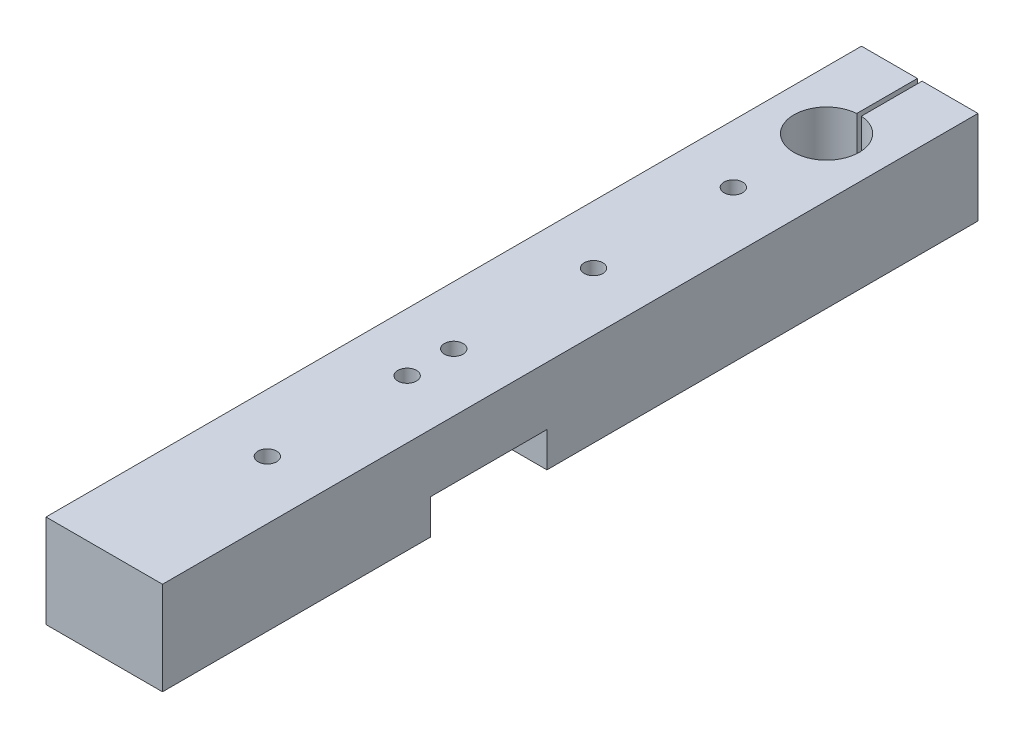
ISO-10303-21;
HEADER;
FILE_DESCRIPTION(('STEP AP214'),'2;1');
FILE_NAME('part.step','',(''),(''),'','','');
FILE_SCHEMA(('AUTOMOTIVE_DESIGN { 1 0 10303 214 1 1 1 1 }'));
ENDSEC;
DATA;
#1=APPLICATION_CONTEXT('core data for automotive mechanical design processes');
#2=APPLICATION_PROTOCOL_DEFINITION('international standard','automotive_design',2000,#1);
#3=PRODUCT_CONTEXT('',#1,'mechanical');
#4=PRODUCT('Part','Part','',(#3));
#5=PRODUCT_RELATED_PRODUCT_CATEGORY('part','',(#4));
#6=PRODUCT_DEFINITION_FORMATION('','',#4);
#7=PRODUCT_DEFINITION_CONTEXT('part definition',#1,'design');
#8=PRODUCT_DEFINITION('design','',#6,#7);
#9=PRODUCT_DEFINITION_SHAPE('','',#8);
#10=(LENGTH_UNIT() NAMED_UNIT(*) SI_UNIT(.MILLI.,.METRE.));
#11=(NAMED_UNIT(*) PLANE_ANGLE_UNIT() SI_UNIT($,.RADIAN.));
#12=(NAMED_UNIT(*) SI_UNIT($,.STERADIAN.) SOLID_ANGLE_UNIT());
#13=UNCERTAINTY_MEASURE_WITH_UNIT(LENGTH_MEASURE(1.E-05),#10,'distance_accuracy_value','');
#14=(GEOMETRIC_REPRESENTATION_CONTEXT(3) GLOBAL_UNCERTAINTY_ASSIGNED_CONTEXT((#13)) GLOBAL_UNIT_ASSIGNED_CONTEXT((#10,
#11,#12)) REPRESENTATION_CONTEXT('',''));
#15=CARTESIAN_POINT('',(0.,0.,0.));
#16=DIRECTION('',(0.,0.,1.));
#17=DIRECTION('',(1.,0.,0.));
#18=AXIS2_PLACEMENT_3D('',#15,#16,#17);
#19=CARTESIAN_POINT('',(25.,0.,-310.));
#20=DIRECTION('',(0.,1.,0.));
#21=DIRECTION('',(0.,0.,1.));
#22=AXIS2_PLACEMENT_3D('',#19,#20,#21);
#23=PLANE('',#22);
#24=CARTESIAN_POINT('',(25.,0.,-70.));
#25=DIRECTION('',(0.,1.,0.));
#26=DIRECTION('',(0.,0.,1.));
#27=AXIS2_PLACEMENT_3D('',#24,#25,#26);
#28=CIRCLE('',#27,4.);
#29=CARTESIAN_POINT('',(25.,0.,-65.9999999999999));
#30=VERTEX_POINT('',#29);
#31=EDGE_CURVE('E184',#30,#30,#28,.T.);
#32=ORIENTED_EDGE('',*,*,#31,.T.);
#33=EDGE_LOOP('',(#32));
#34=FACE_BOUND('',#33,.T.);
#35=DIRECTION('',(0.,0.,1.));
#36=VECTOR('',#35,1.);
#37=CARTESIAN_POINT('',(0.,0.,0.));
#38=LINE('',#37,#36);
#39=CARTESIAN_POINT('',(0.,0.,-115.));
#40=VERTEX_POINT('',#39);
#41=CARTESIAN_POINT('',(0.,0.,0.));
#42=VERTEX_POINT('',#41);
#43=EDGE_CURVE('E150',#40,#42,#38,.T.);
#44=ORIENTED_EDGE('',*,*,#43,.F.);
#45=DIRECTION('',(-1.,0.,0.));
#46=VECTOR('',#45,1.);
#47=CARTESIAN_POINT('',(0.,0.,-115.));
#48=LINE('',#47,#46);
#49=CARTESIAN_POINT('',(50.,0.,-115.));
#50=VERTEX_POINT('',#49);
#51=EDGE_CURVE('E258',#50,#40,#48,.T.);
#52=ORIENTED_EDGE('',*,*,#51,.F.);
#53=DIRECTION('',(0.,0.,-1.));
#54=VECTOR('',#53,1.);
#55=CARTESIAN_POINT('',(50.,0.,0.));
#56=LINE('',#55,#54);
#57=CARTESIAN_POINT('',(50.,0.,0.));
#58=VERTEX_POINT('',#57);
#59=EDGE_CURVE('E153',#58,#50,#56,.T.);
#60=ORIENTED_EDGE('',*,*,#59,.F.);
#61=DIRECTION('',(1.,0.,0.));
#62=VECTOR('',#61,1.);
#63=CARTESIAN_POINT('',(0.,0.,0.));
#64=LINE('',#63,#62);
#65=EDGE_CURVE('E149',#42,#58,#64,.T.);
#66=ORIENTED_EDGE('',*,*,#65,.F.);
#67=EDGE_LOOP('',(#44,#52,#60,#66));
#68=FACE_BOUND('',#67,.T.);
#69=ADVANCED_FACE('F35',(#34,#68),#23,.F.);
#70=CARTESIAN_POINT('',(25.,-10.,-130.));
#71=DIRECTION('',(0.,1.,0.));
#72=DIRECTION('',(0.,0.,1.));
#73=AXIS2_PLACEMENT_3D('',#70,#71,#72);
#74=CYLINDRICAL_SURFACE('',#73,4.);
#75=CARTESIAN_POINT('',(25.,40.,-130.));
#76=DIRECTION('',(0.,1.,0.));
#77=DIRECTION('',(0.,0.,1.));
#78=AXIS2_PLACEMENT_3D('',#75,#76,#77);
#79=CIRCLE('',#78,4.);
#80=CARTESIAN_POINT('',(25.,40.,-126.));
#81=VERTEX_POINT('',#80);
#82=EDGE_CURVE('E204',#81,#81,#79,.T.);
#83=ORIENTED_EDGE('',*,*,#82,.T.);
#84=EDGE_LOOP('',(#83));
#85=FACE_BOUND('',#84,.T.);
#86=CARTESIAN_POINT('',(25.,15.,-130.));
#87=DIRECTION('',(0.,-1.,0.));
#88=DIRECTION('',(0.,0.,-1.));
#89=AXIS2_PLACEMENT_3D('',#86,#87,#88);
#90=CIRCLE('',#89,4.);
#91=CARTESIAN_POINT('',(25.,15.,-134.));
#92=VERTEX_POINT('',#91);
#93=EDGE_CURVE('E192',#92,#92,#90,.F.);
#94=ORIENTED_EDGE('',*,*,#93,.F.);
#95=EDGE_LOOP('',(#94));
#96=FACE_BOUND('',#95,.T.);
#97=ADVANCED_FACE('F293',(#85,#96),#74,.F.);
#98=CARTESIAN_POINT('',(25.,-10.,-150.));
#99=DIRECTION('',(0.,1.,0.));
#100=DIRECTION('',(0.,0.,1.));
#101=AXIS2_PLACEMENT_3D('',#98,#99,#100);
#102=CYLINDRICAL_SURFACE('',#101,4.);
#103=CARTESIAN_POINT('',(25.,40.,-150.));
#104=DIRECTION('',(0.,1.,0.));
#105=DIRECTION('',(0.,0.,1.));
#106=AXIS2_PLACEMENT_3D('',#103,#104,#105);
#107=CIRCLE('',#106,4.);
#108=CARTESIAN_POINT('',(25.,40.,-146.));
#109=VERTEX_POINT('',#108);
#110=EDGE_CURVE('E179',#109,#109,#107,.T.);
#111=ORIENTED_EDGE('',*,*,#110,.T.);
#112=EDGE_LOOP('',(#111));
#113=FACE_BOUND('',#112,.T.);
#114=CARTESIAN_POINT('',(25.,15.,-150.));
#115=DIRECTION('',(0.,-1.,0.));
#116=DIRECTION('',(0.,0.,-1.));
#117=AXIS2_PLACEMENT_3D('',#114,#115,#116);
#118=CIRCLE('',#117,4.);
#119=CARTESIAN_POINT('',(25.,15.,-154.));
#120=VERTEX_POINT('',#119);
#121=EDGE_CURVE('E39',#120,#120,#118,.F.);
#122=ORIENTED_EDGE('',*,*,#121,.F.);
#123=EDGE_LOOP('',(#122));
#124=FACE_BOUND('',#123,.T.);
#125=ADVANCED_FACE('F295',(#113,#124),#102,.F.);
#126=CARTESIAN_POINT('',(0.,40.,0.));
#127=DIRECTION('',(1.,0.,0.));
#128=DIRECTION('',(0.,0.,-1.));
#129=AXIS2_PLACEMENT_3D('',#126,#127,#128);
#130=PLANE('',#129);
#131=DIRECTION('',(0.,0.,-1.));
#132=VECTOR('',#131,1.);
#133=CARTESIAN_POINT('',(0.,15.,-115.));
#134=LINE('',#133,#132);
#135=CARTESIAN_POINT('',(0.,15.,-115.));
#136=VERTEX_POINT('',#135);
#137=CARTESIAN_POINT('',(0.,15.,-165.));
#138=VERTEX_POINT('',#137);
#139=EDGE_CURVE('E268',#136,#138,#134,.T.);
#140=ORIENTED_EDGE('',*,*,#139,.F.);
#141=DIRECTION('',(0.,-1.,0.));
#142=VECTOR('',#141,1.);
#143=CARTESIAN_POINT('',(0.,15.,-115.));
#144=LINE('',#143,#142);
#145=EDGE_CURVE('E262',#136,#40,#144,.T.);
#146=ORIENTED_EDGE('',*,*,#145,.T.);
#147=ORIENTED_EDGE('',*,*,#43,.T.);
#148=DIRECTION('',(0.,-1.,0.));
#149=VECTOR('',#148,1.);
#150=CARTESIAN_POINT('',(0.,40.,0.));
#151=LINE('',#150,#149);
#152=CARTESIAN_POINT('',(0.,40.,0.));
#153=VERTEX_POINT('',#152);
#154=EDGE_CURVE('E11',#153,#42,#151,.T.);
#155=ORIENTED_EDGE('',*,*,#154,.F.);
#156=DIRECTION('',(0.,0.,1.));
#157=VECTOR('',#156,1.);
#158=CARTESIAN_POINT('',(0.,40.,0.));
#159=LINE('',#158,#157);
#160=CARTESIAN_POINT('',(0.,40.,-350.));
#161=VERTEX_POINT('',#160);
#162=EDGE_CURVE('E164',#161,#153,#159,.T.);
#163=ORIENTED_EDGE('',*,*,#162,.F.);
#164=DIRECTION('',(0.,-1.,0.));
#165=VECTOR('',#164,1.);
#166=CARTESIAN_POINT('',(0.,40.,-350.));
#167=LINE('',#166,#165);
#168=CARTESIAN_POINT('',(0.,0.,-350.));
#169=VERTEX_POINT('',#168);
#170=EDGE_CURVE('E142',#161,#169,#167,.T.);
#171=ORIENTED_EDGE('',*,*,#170,.T.);
#172=CARTESIAN_POINT('',(0.,0.,-165.));
#173=VERTEX_POINT('',#172);
#174=EDGE_CURVE('E146',#169,#173,#38,.T.);
#175=ORIENTED_EDGE('',*,*,#174,.T.);
#176=DIRECTION('',(0.,-1.,0.));
#177=VECTOR('',#176,1.);
#178=CARTESIAN_POINT('',(0.,15.,-165.));
#179=LINE('',#178,#177);
#180=EDGE_CURVE('E52',#138,#173,#179,.T.);
#181=ORIENTED_EDGE('',*,*,#180,.F.);
#182=EDGE_LOOP('',(#140,#146,#147,#155,#163,#171,#175,#181));
#183=FACE_BOUND('',#182,.T.);
#184=ADVANCED_FACE('F37',(#183),#130,.F.);
#185=CARTESIAN_POINT('',(0.,40.,0.));
#186=DIRECTION('',(0.,0.,-1.));
#187=DIRECTION('',(-1.,0.,0.));
#188=AXIS2_PLACEMENT_3D('',#185,#186,#187);
#189=PLANE('',#188);
#190=ORIENTED_EDGE('',*,*,#65,.T.);
#191=DIRECTION('',(0.,-1.,0.));
#192=VECTOR('',#191,1.);
#193=CARTESIAN_POINT('',(50.,40.,0.));
#194=LINE('',#193,#192);
#195=CARTESIAN_POINT('',(50.,40.,0.));
#196=VERTEX_POINT('',#195);
#197=EDGE_CURVE('E44',#196,#58,#194,.T.);
#198=ORIENTED_EDGE('',*,*,#197,.F.);
#199=DIRECTION('',(1.,0.,0.));
#200=VECTOR('',#199,1.);
#201=CARTESIAN_POINT('',(0.,40.,0.));
#202=LINE('',#201,#200);
#203=EDGE_CURVE('E102',#153,#196,#202,.T.);
#204=ORIENTED_EDGE('',*,*,#203,.F.);
#205=ORIENTED_EDGE('',*,*,#154,.T.);
#206=EDGE_LOOP('',(#190,#198,#204,#205));
#207=FACE_BOUND('',#206,.T.);
#208=ADVANCED_FACE('F231',(#207),#189,.F.);
#209=CARTESIAN_POINT('',(50.,40.,0.));
#210=DIRECTION('',(-1.,0.,0.));
#211=DIRECTION('',(0.,0.,1.));
#212=AXIS2_PLACEMENT_3D('',#209,#210,#211);
#213=PLANE('',#212);
#214=ORIENTED_EDGE('',*,*,#59,.T.);
#215=DIRECTION('',(0.,-1.,0.));
#216=VECTOR('',#215,1.);
#217=CARTESIAN_POINT('',(50.,15.,-115.));
#218=LINE('',#217,#216);
#219=CARTESIAN_POINT('',(50.,15.,-115.));
#220=VERTEX_POINT('',#219);
#221=EDGE_CURVE('E265',#220,#50,#218,.T.);
#222=ORIENTED_EDGE('',*,*,#221,.F.);
#223=DIRECTION('',(0.,0.,1.));
#224=VECTOR('',#223,1.);
#225=CARTESIAN_POINT('',(50.,15.,-115.));
#226=LINE('',#225,#224);
#227=CARTESIAN_POINT('',(50.,15.,-165.));
#228=VERTEX_POINT('',#227);
#229=EDGE_CURVE('E272',#228,#220,#226,.T.);
#230=ORIENTED_EDGE('',*,*,#229,.F.);
#231=DIRECTION('',(0.,-1.,0.));
#232=VECTOR('',#231,1.);
#233=CARTESIAN_POINT('',(50.,15.,-165.));
#234=LINE('',#233,#232);
#235=CARTESIAN_POINT('',(50.,0.,-165.));
#236=VERTEX_POINT('',#235);
#237=EDGE_CURVE('E273',#228,#236,#234,.T.);
#238=ORIENTED_EDGE('',*,*,#237,.T.);
#239=CARTESIAN_POINT('',(50.,0.,-350.));
#240=VERTEX_POINT('',#239);
#241=EDGE_CURVE('E152',#236,#240,#56,.T.);
#242=ORIENTED_EDGE('',*,*,#241,.T.);
#243=DIRECTION('',(0.,-1.,0.));
#244=VECTOR('',#243,1.);
#245=CARTESIAN_POINT('',(50.,40.,-350.));
#246=LINE('',#245,#244);
#247=CARTESIAN_POINT('',(50.,40.,-350.));
#248=VERTEX_POINT('',#247);
#249=EDGE_CURVE('E171',#248,#240,#246,.T.);
#250=ORIENTED_EDGE('',*,*,#249,.F.);
#251=DIRECTION('',(0.,0.,-1.));
#252=VECTOR('',#251,1.);
#253=CARTESIAN_POINT('',(50.,40.,0.));
#254=LINE('',#253,#252);
#255=EDGE_CURVE('E209',#196,#248,#254,.T.);
#256=ORIENTED_EDGE('',*,*,#255,.F.);
#257=ORIENTED_EDGE('',*,*,#197,.T.);
#258=EDGE_LOOP('',(#214,#222,#230,#238,#242,#250,#256,#257));
#259=FACE_BOUND('',#258,.T.);
#260=ADVANCED_FACE('F235',(#259),#213,.F.);
#261=CARTESIAN_POINT('',(26.,40.,-350.));
#262=DIRECTION('',(0.,0.,1.));
#263=DIRECTION('',(1.,0.,0.));
#264=AXIS2_PLACEMENT_3D('',#261,#262,#263);
#265=PLANE('',#264);
#266=DIRECTION('',(-1.,0.,0.));
#267=VECTOR('',#266,1.);
#268=CARTESIAN_POINT('',(26.,0.,-350.));
#269=LINE('',#268,#267);
#270=CARTESIAN_POINT('',(26.,0.,-350.));
#271=VERTEX_POINT('',#270);
#272=EDGE_CURVE('E156',#240,#271,#269,.T.);
#273=ORIENTED_EDGE('',*,*,#272,.T.);
#274=DIRECTION('',(0.,-1.,0.));
#275=VECTOR('',#274,1.);
#276=CARTESIAN_POINT('',(26.,40.,-350.));
#277=LINE('',#276,#275);
#278=CARTESIAN_POINT('',(26.,40.,-350.));
#279=VERTEX_POINT('',#278);
#280=EDGE_CURVE('E168',#279,#271,#277,.T.);
#281=ORIENTED_EDGE('',*,*,#280,.F.);
#282=DIRECTION('',(-1.,0.,0.));
#283=VECTOR('',#282,1.);
#284=CARTESIAN_POINT('',(26.,40.,-350.));
#285=LINE('',#284,#283);
#286=EDGE_CURVE('E211',#248,#279,#285,.T.);
#287=ORIENTED_EDGE('',*,*,#286,.F.);
#288=ORIENTED_EDGE('',*,*,#249,.T.);
#289=EDGE_LOOP('',(#273,#281,#287,#288));
#290=FACE_BOUND('',#289,.T.);
#291=ADVANCED_FACE('F217',(#290),#265,.F.);
#292=CARTESIAN_POINT('',(26.,40.,-350.));
#293=DIRECTION('',(1.,0.,0.));
#294=DIRECTION('',(0.,0.,-1.));
#295=AXIS2_PLACEMENT_3D('',#292,#293,#294);
#296=PLANE('',#295);
#297=DIRECTION('',(0.,0.,1.));
#298=VECTOR('',#297,1.);
#299=CARTESIAN_POINT('',(26.,0.,-350.));
#300=LINE('',#299,#298);
#301=CARTESIAN_POINT('',(26.,0.,-323.964240043769));
#302=VERTEX_POINT('',#301);
#303=EDGE_CURVE('E158',#271,#302,#300,.T.);
#304=ORIENTED_EDGE('',*,*,#303,.T.);
#305=DIRECTION('',(0.,-1.,0.));
#306=VECTOR('',#305,1.);
#307=CARTESIAN_POINT('',(26.,40.,-323.964240043769));
#308=LINE('',#307,#306);
#309=CARTESIAN_POINT('',(26.,40.,-323.964240043769));
#310=VERTEX_POINT('',#309);
#311=EDGE_CURVE('E137',#310,#302,#308,.T.);
#312=ORIENTED_EDGE('',*,*,#311,.F.);
#313=DIRECTION('',(0.,0.,1.));
#314=VECTOR('',#313,1.);
#315=CARTESIAN_POINT('',(26.,40.,-350.));
#316=LINE('',#315,#314);
#317=EDGE_CURVE('E125',#279,#310,#316,.T.);
#318=ORIENTED_EDGE('',*,*,#317,.F.);
#319=ORIENTED_EDGE('',*,*,#280,.T.);
#320=EDGE_LOOP('',(#304,#312,#318,#319));
#321=FACE_BOUND('',#320,.T.);
#322=ADVANCED_FACE('F221',(#321),#296,.F.);
#323=CARTESIAN_POINT('',(25.,40.,-310.));
#324=DIRECTION('',(0.,-1.,0.));
#325=DIRECTION('',(0.,0.,-1.));
#326=AXIS2_PLACEMENT_3D('',#323,#324,#325);
#327=CYLINDRICAL_SURFACE('',#326,14.);
#328=CARTESIAN_POINT('',(25.,0.,-310.));
#329=DIRECTION('',(0.,-1.,0.));
#330=DIRECTION('',(0.,0.,1.));
#331=AXIS2_PLACEMENT_3D('',#328,#329,#330);
#332=CIRCLE('',#331,14.);
#333=CARTESIAN_POINT('',(24.,0.,-323.964240043769));
#334=VERTEX_POINT('',#333);
#335=EDGE_CURVE('E134',#302,#334,#332,.T.);
#336=ORIENTED_EDGE('',*,*,#335,.T.);
#337=DIRECTION('',(0.,-1.,0.));
#338=VECTOR('',#337,1.);
#339=CARTESIAN_POINT('',(24.,40.,-323.964240043769));
#340=LINE('',#339,#338);
#341=CARTESIAN_POINT('',(24.,40.,-323.964240043769));
#342=VERTEX_POINT('',#341);
#343=EDGE_CURVE('E131',#342,#334,#340,.T.);
#344=ORIENTED_EDGE('',*,*,#343,.F.);
#345=CARTESIAN_POINT('',(25.,40.,-310.));
#346=DIRECTION('',(0.,-1.,0.));
#347=DIRECTION('',(0.,0.,1.));
#348=AXIS2_PLACEMENT_3D('',#345,#346,#347);
#349=CIRCLE('',#348,14.);
#350=EDGE_CURVE('E118',#310,#342,#349,.T.);
#351=ORIENTED_EDGE('',*,*,#350,.F.);
#352=ORIENTED_EDGE('',*,*,#311,.T.);
#353=EDGE_LOOP('',(#336,#344,#351,#352));
#354=FACE_BOUND('',#353,.T.);
#355=ADVANCED_FACE('F132',(#354),#327,.F.);
#356=CARTESIAN_POINT('',(24.,40.,-350.));
#357=DIRECTION('',(-1.,0.,0.));
#358=DIRECTION('',(0.,0.,1.));
#359=AXIS2_PLACEMENT_3D('',#356,#357,#358);
#360=PLANE('',#359);
#361=DIRECTION('',(0.,0.,-1.));
#362=VECTOR('',#361,1.);
#363=CARTESIAN_POINT('',(24.,0.,-350.));
#364=LINE('',#363,#362);
#365=CARTESIAN_POINT('',(24.,0.,-350.));
#366=VERTEX_POINT('',#365);
#367=EDGE_CURVE('E161',#334,#366,#364,.T.);
#368=ORIENTED_EDGE('',*,*,#367,.T.);
#369=DIRECTION('',(0.,-1.,0.));
#370=VECTOR('',#369,1.);
#371=CARTESIAN_POINT('',(24.,40.,-350.));
#372=LINE('',#371,#370);
#373=CARTESIAN_POINT('',(24.,40.,-350.));
#374=VERTEX_POINT('',#373);
#375=EDGE_CURVE('E138',#374,#366,#372,.T.);
#376=ORIENTED_EDGE('',*,*,#375,.F.);
#377=DIRECTION('',(0.,0.,-1.));
#378=VECTOR('',#377,1.);
#379=CARTESIAN_POINT('',(24.,40.,-350.));
#380=LINE('',#379,#378);
#381=EDGE_CURVE('E122',#342,#374,#380,.T.);
#382=ORIENTED_EDGE('',*,*,#381,.F.);
#383=ORIENTED_EDGE('',*,*,#343,.T.);
#384=EDGE_LOOP('',(#368,#376,#382,#383));
#385=FACE_BOUND('',#384,.T.);
#386=ADVANCED_FACE('F140',(#385),#360,.F.);
#387=CARTESIAN_POINT('',(0.,40.,-350.));
#388=DIRECTION('',(0.,0.,1.));
#389=DIRECTION('',(1.,0.,0.));
#390=AXIS2_PLACEMENT_3D('',#387,#388,#389);
#391=PLANE('',#390);
#392=DIRECTION('',(-1.,0.,0.));
#393=VECTOR('',#392,1.);
#394=CARTESIAN_POINT('',(0.,0.,-350.));
#395=LINE('',#394,#393);
#396=EDGE_CURVE('E94',#366,#169,#395,.T.);
#397=ORIENTED_EDGE('',*,*,#396,.T.);
#398=ORIENTED_EDGE('',*,*,#170,.F.);
#399=DIRECTION('',(-1.,0.,0.));
#400=VECTOR('',#399,1.);
#401=CARTESIAN_POINT('',(0.,40.,-350.));
#402=LINE('',#401,#400);
#403=EDGE_CURVE('E61',#374,#161,#402,.T.);
#404=ORIENTED_EDGE('',*,*,#403,.F.);
#405=ORIENTED_EDGE('',*,*,#375,.T.);
#406=EDGE_LOOP('',(#397,#398,#404,#405));
#407=FACE_BOUND('',#406,.T.);
#408=ADVANCED_FACE('F226',(#407),#391,.F.);
#409=CARTESIAN_POINT('',(25.,40.,-310.));
#410=DIRECTION('',(0.,1.,0.));
#411=DIRECTION('',(0.,0.,1.));
#412=AXIS2_PLACEMENT_3D('',#409,#410,#411);
#413=PLANE('',#412);
#414=CARTESIAN_POINT('',(25.,40.,-70.));
#415=DIRECTION('',(0.,1.,0.));
#416=DIRECTION('',(0.,0.,1.));
#417=AXIS2_PLACEMENT_3D('',#414,#415,#416);
#418=CIRCLE('',#417,4.);
#419=CARTESIAN_POINT('',(25.,40.,-65.9999999999999));
#420=VERTEX_POINT('',#419);
#421=EDGE_CURVE('E186',#420,#420,#418,.T.);
#422=ORIENTED_EDGE('',*,*,#421,.F.);
#423=EDGE_LOOP('',(#422));
#424=FACE_BOUND('',#423,.T.);
#425=CARTESIAN_POINT('',(25.,40.,-210.));
#426=DIRECTION('',(0.,1.,0.));
#427=DIRECTION('',(0.,0.,1.));
#428=AXIS2_PLACEMENT_3D('',#425,#426,#427);
#429=CIRCLE('',#428,4.);
#430=CARTESIAN_POINT('',(25.,40.,-206.));
#431=VERTEX_POINT('',#430);
#432=EDGE_CURVE('E183',#431,#431,#429,.T.);
#433=ORIENTED_EDGE('',*,*,#432,.F.);
#434=EDGE_LOOP('',(#433));
#435=FACE_BOUND('',#434,.T.);
#436=CARTESIAN_POINT('',(25.,40.,-270.));
#437=DIRECTION('',(0.,1.,0.));
#438=DIRECTION('',(0.,0.,1.));
#439=AXIS2_PLACEMENT_3D('',#436,#437,#438);
#440=CIRCLE('',#439,4.);
#441=CARTESIAN_POINT('',(25.,40.,-266.));
#442=VERTEX_POINT('',#441);
#443=EDGE_CURVE('E180',#442,#442,#440,.T.);
#444=ORIENTED_EDGE('',*,*,#443,.F.);
#445=EDGE_LOOP('',(#444));
#446=FACE_BOUND('',#445,.T.);
#447=ORIENTED_EDGE('',*,*,#110,.F.);
#448=EDGE_LOOP('',(#447));
#449=FACE_BOUND('',#448,.T.);
#450=ORIENTED_EDGE('',*,*,#82,.F.);
#451=EDGE_LOOP('',(#450));
#452=FACE_BOUND('',#451,.T.);
#453=ORIENTED_EDGE('',*,*,#162,.T.);
#454=ORIENTED_EDGE('',*,*,#203,.T.);
#455=ORIENTED_EDGE('',*,*,#255,.T.);
#456=ORIENTED_EDGE('',*,*,#286,.T.);
#457=ORIENTED_EDGE('',*,*,#317,.T.);
#458=ORIENTED_EDGE('',*,*,#350,.T.);
#459=ORIENTED_EDGE('',*,*,#381,.T.);
#460=ORIENTED_EDGE('',*,*,#403,.T.);
#461=EDGE_LOOP('',(#453,#454,#455,#456,#457,#458,#459,#460));
#462=FACE_BOUND('',#461,.T.);
#463=ADVANCED_FACE('F120',(#424,#435,#446,#449,#452,#462),#413,.T.);
#464=CARTESIAN_POINT('',(25.,0.,-210.));
#465=DIRECTION('',(0.,1.,0.));
#466=DIRECTION('',(0.,0.,1.));
#467=AXIS2_PLACEMENT_3D('',#464,#465,#466);
#468=CIRCLE('',#467,4.);
#469=CARTESIAN_POINT('',(25.,0.,-206.));
#470=VERTEX_POINT('',#469);
#471=EDGE_CURVE('E181',#470,#470,#468,.T.);
#472=ORIENTED_EDGE('',*,*,#471,.T.);
#473=EDGE_LOOP('',(#472));
#474=FACE_BOUND('',#473,.T.);
#475=CARTESIAN_POINT('',(25.,0.,-270.));
#476=DIRECTION('',(0.,1.,0.));
#477=DIRECTION('',(0.,0.,1.));
#478=AXIS2_PLACEMENT_3D('',#475,#476,#477);
#479=CIRCLE('',#478,4.);
#480=CARTESIAN_POINT('',(25.,0.,-266.));
#481=VERTEX_POINT('',#480);
#482=EDGE_CURVE('E176',#481,#481,#479,.T.);
#483=ORIENTED_EDGE('',*,*,#482,.T.);
#484=EDGE_LOOP('',(#483));
#485=FACE_BOUND('',#484,.T.);
#486=ORIENTED_EDGE('',*,*,#241,.F.);
#487=DIRECTION('',(1.,0.,0.));
#488=VECTOR('',#487,1.);
#489=CARTESIAN_POINT('',(0.,0.,-165.));
#490=LINE('',#489,#488);
#491=EDGE_CURVE('E238',#173,#236,#490,.T.);
#492=ORIENTED_EDGE('',*,*,#491,.F.);
#493=ORIENTED_EDGE('',*,*,#174,.F.);
#494=ORIENTED_EDGE('',*,*,#396,.F.);
#495=ORIENTED_EDGE('',*,*,#367,.F.);
#496=ORIENTED_EDGE('',*,*,#335,.F.);
#497=ORIENTED_EDGE('',*,*,#303,.F.);
#498=ORIENTED_EDGE('',*,*,#272,.F.);
#499=EDGE_LOOP('',(#486,#492,#493,#494,#495,#496,#497,#498));
#500=FACE_BOUND('',#499,.T.);
#501=ADVANCED_FACE('F224',(#474,#485,#500),#23,.F.);
#502=CARTESIAN_POINT('',(25.,-10.,-270.));
#503=DIRECTION('',(0.,1.,0.));
#504=DIRECTION('',(0.,0.,1.));
#505=AXIS2_PLACEMENT_3D('',#502,#503,#504);
#506=CYLINDRICAL_SURFACE('',#505,4.);
#507=ORIENTED_EDGE('',*,*,#443,.T.);
#508=EDGE_LOOP('',(#507));
#509=FACE_BOUND('',#508,.T.);
#510=ORIENTED_EDGE('',*,*,#482,.F.);
#511=EDGE_LOOP('',(#510));
#512=FACE_BOUND('',#511,.T.);
#513=ADVANCED_FACE('F311',(#509,#512),#506,.F.);
#514=CARTESIAN_POINT('',(25.,-10.,-210.));
#515=DIRECTION('',(0.,1.,0.));
#516=DIRECTION('',(0.,0.,1.));
#517=AXIS2_PLACEMENT_3D('',#514,#515,#516);
#518=CYLINDRICAL_SURFACE('',#517,4.);
#519=ORIENTED_EDGE('',*,*,#432,.T.);
#520=EDGE_LOOP('',(#519));
#521=FACE_BOUND('',#520,.T.);
#522=ORIENTED_EDGE('',*,*,#471,.F.);
#523=EDGE_LOOP('',(#522));
#524=FACE_BOUND('',#523,.T.);
#525=ADVANCED_FACE('F355',(#521,#524),#518,.F.);
#526=CARTESIAN_POINT('',(25.,-10.,-70.));
#527=DIRECTION('',(0.,1.,0.));
#528=DIRECTION('',(0.,0.,1.));
#529=AXIS2_PLACEMENT_3D('',#526,#527,#528);
#530=CYLINDRICAL_SURFACE('',#529,4.);
#531=ORIENTED_EDGE('',*,*,#421,.T.);
#532=EDGE_LOOP('',(#531));
#533=FACE_BOUND('',#532,.T.);
#534=ORIENTED_EDGE('',*,*,#31,.F.);
#535=EDGE_LOOP('',(#534));
#536=FACE_BOUND('',#535,.T.);
#537=ADVANCED_FACE('F286',(#533,#536),#530,.F.);
#538=CARTESIAN_POINT('',(0.,15.,0.));
#539=DIRECTION('',(0.,-1.,0.));
#540=DIRECTION('',(0.,0.,-1.));
#541=AXIS2_PLACEMENT_3D('',#538,#539,#540);
#542=PLANE('',#541);
#543=ORIENTED_EDGE('',*,*,#139,.T.);
#544=DIRECTION('',(1.,0.,0.));
#545=VECTOR('',#544,1.);
#546=CARTESIAN_POINT('',(0.,15.,-165.));
#547=LINE('',#546,#545);
#548=EDGE_CURVE('E253',#138,#228,#547,.T.);
#549=ORIENTED_EDGE('',*,*,#548,.T.);
#550=ORIENTED_EDGE('',*,*,#229,.T.);
#551=DIRECTION('',(-1.,0.,0.));
#552=VECTOR('',#551,1.);
#553=CARTESIAN_POINT('',(0.,15.,-115.));
#554=LINE('',#553,#552);
#555=EDGE_CURVE('E276',#220,#136,#554,.T.);
#556=ORIENTED_EDGE('',*,*,#555,.T.);
#557=EDGE_LOOP('',(#543,#549,#550,#556));
#558=FACE_BOUND('',#557,.T.);
#559=ORIENTED_EDGE('',*,*,#121,.T.);
#560=EDGE_LOOP('',(#559));
#561=FACE_BOUND('',#560,.T.);
#562=ORIENTED_EDGE('',*,*,#93,.T.);
#563=EDGE_LOOP('',(#562));
#564=FACE_BOUND('',#563,.T.);
#565=ADVANCED_FACE('F283',(#558,#561,#564),#542,.T.);
#566=CARTESIAN_POINT('',(0.,15.,-115.));
#567=DIRECTION('',(0.,0.,1.));
#568=DIRECTION('',(1.,0.,0.));
#569=AXIS2_PLACEMENT_3D('',#566,#567,#568);
#570=PLANE('',#569);
#571=ORIENTED_EDGE('',*,*,#51,.T.);
#572=ORIENTED_EDGE('',*,*,#145,.F.);
#573=ORIENTED_EDGE('',*,*,#555,.F.);
#574=ORIENTED_EDGE('',*,*,#221,.T.);
#575=EDGE_LOOP('',(#571,#572,#573,#574));
#576=FACE_BOUND('',#575,.T.);
#577=ADVANCED_FACE('F260',(#576),#570,.F.);
#578=CARTESIAN_POINT('',(0.,15.,-165.));
#579=DIRECTION('',(0.,0.,-1.));
#580=DIRECTION('',(-1.,0.,0.));
#581=AXIS2_PLACEMENT_3D('',#578,#579,#580);
#582=PLANE('',#581);
#583=ORIENTED_EDGE('',*,*,#491,.T.);
#584=ORIENTED_EDGE('',*,*,#237,.F.);
#585=ORIENTED_EDGE('',*,*,#548,.F.);
#586=ORIENTED_EDGE('',*,*,#180,.T.);
#587=EDGE_LOOP('',(#583,#584,#585,#586));
#588=FACE_BOUND('',#587,.T.);
#589=ADVANCED_FACE('F439',(#588),#582,.F.);
#590=CLOSED_SHELL('',(#69,#97,#125,#184,#208,#260,#291,#322,#355,#386,#408,#463,#501,#513,#525,
#537,#565,#577,#589));
#591=MANIFOLD_SOLID_BREP('B2',#590);
#592=ADVANCED_BREP_SHAPE_REPRESENTATION('',(#18,#591),#14);
#593=SHAPE_DEFINITION_REPRESENTATION(#9,#592);
ENDSEC;
END-ISO-10303-21;
